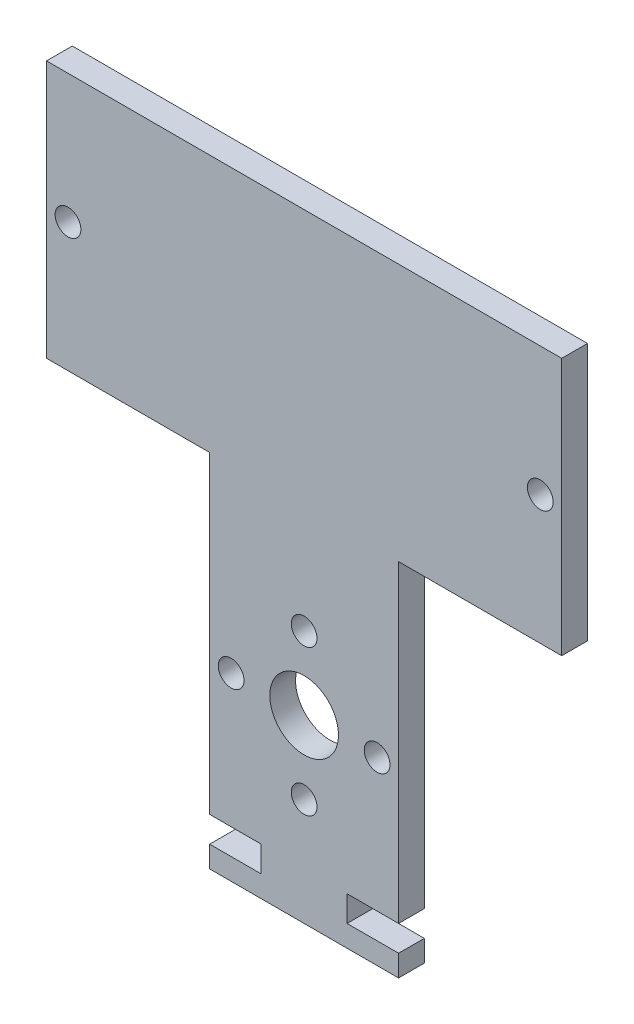
ISO-10303-21;
HEADER;
FILE_DESCRIPTION(('STEP AP214'),'2;1');
FILE_NAME('part.step','',(''),(''),'','','');
FILE_SCHEMA(('AUTOMOTIVE_DESIGN { 1 0 10303 214 1 1 1 1 }'));
ENDSEC;
DATA;
#1=APPLICATION_CONTEXT('core data for automotive mechanical design processes');
#2=APPLICATION_PROTOCOL_DEFINITION('international standard','automotive_design',2000,#1);
#3=PRODUCT_CONTEXT('',#1,'mechanical');
#4=PRODUCT('Part','Part','',(#3));
#5=PRODUCT_RELATED_PRODUCT_CATEGORY('part','',(#4));
#6=PRODUCT_DEFINITION_FORMATION('','',#4);
#7=PRODUCT_DEFINITION_CONTEXT('part definition',#1,'design');
#8=PRODUCT_DEFINITION('design','',#6,#7);
#9=PRODUCT_DEFINITION_SHAPE('','',#8);
#10=(LENGTH_UNIT() NAMED_UNIT(*) SI_UNIT(.MILLI.,.METRE.));
#11=(NAMED_UNIT(*) PLANE_ANGLE_UNIT() SI_UNIT($,.RADIAN.));
#12=(NAMED_UNIT(*) SI_UNIT($,.STERADIAN.) SOLID_ANGLE_UNIT());
#13=UNCERTAINTY_MEASURE_WITH_UNIT(LENGTH_MEASURE(1.E-05),#10,'distance_accuracy_value','');
#14=(GEOMETRIC_REPRESENTATION_CONTEXT(3) GLOBAL_UNCERTAINTY_ASSIGNED_CONTEXT((#13)) GLOBAL_UNIT_ASSIGNED_CONTEXT((#10,
#11,#12)) REPRESENTATION_CONTEXT('',''));
#15=CARTESIAN_POINT('',(0.,0.,0.));
#16=DIRECTION('',(0.,0.,1.));
#17=DIRECTION('',(1.,0.,0.));
#18=AXIS2_PLACEMENT_3D('',#15,#16,#17);
#19=CARTESIAN_POINT('',(0.,0.,3.));
#20=DIRECTION('',(0.,0.,1.));
#21=DIRECTION('',(1.,0.,0.));
#22=AXIS2_PLACEMENT_3D('',#19,#20,#21);
#23=PLANE('',#22);
#24=CARTESIAN_POINT('',(-27.5,36.,3.));
#25=DIRECTION('',(0.,0.,1.));
#26=DIRECTION('',(1.,0.,0.));
#27=AXIS2_PLACEMENT_3D('',#24,#25,#26);
#28=CIRCLE('',#27,1.5);
#29=CARTESIAN_POINT('',(-26.,36.,3.));
#30=VERTEX_POINT('',#29);
#31=EDGE_CURVE('E556',#30,#30,#28,.T.);
#32=ORIENTED_EDGE('',*,*,#31,.F.);
#33=EDGE_LOOP('',(#32));
#34=FACE_BOUND('',#33,.T.);
#35=CARTESIAN_POINT('',(-8.49999999999952,-4.82648585427231E-13,3.));
#36=DIRECTION('',(0.,0.,1.));
#37=DIRECTION('',(1.,0.,0.));
#38=AXIS2_PLACEMENT_3D('',#35,#36,#37);
#39=CIRCLE('',#38,1.50000000000069);
#40=CARTESIAN_POINT('',(-6.99999999999883,-4.82648585427231E-13,3.));
#41=VERTEX_POINT('',#40);
#42=EDGE_CURVE('E568',#41,#41,#39,.T.);
#43=ORIENTED_EDGE('',*,*,#42,.F.);
#44=EDGE_LOOP('',(#43));
#45=FACE_BOUND('',#44,.T.);
#46=CARTESIAN_POINT('',(8.50000000000048,4.81607635647955E-13,3.));
#47=DIRECTION('',(0.,0.,1.));
#48=DIRECTION('',(1.,0.,0.));
#49=AXIS2_PLACEMENT_3D('',#46,#47,#48);
#50=CIRCLE('',#49,1.50000000000035);
#51=CARTESIAN_POINT('',(10.0000000000008,4.81607635647955E-13,3.));
#52=VERTEX_POINT('',#51);
#53=EDGE_CURVE('E580',#52,#52,#50,.T.);
#54=ORIENTED_EDGE('',*,*,#53,.F.);
#55=EDGE_LOOP('',(#54));
#56=FACE_BOUND('',#55,.T.);
#57=DIRECTION('',(0.,-1.,0.));
#58=VECTOR('',#57,1.);
#59=CARTESIAN_POINT('',(-11.,0.,3.));
#60=LINE('',#59,#58);
#61=CARTESIAN_POINT('',(-11.,21.,3.));
#62=VERTEX_POINT('',#61);
#63=CARTESIAN_POINT('',(-11.,-15.5,3.));
#64=VERTEX_POINT('',#63);
#65=EDGE_CURVE('E122',#62,#64,#60,.T.);
#66=ORIENTED_EDGE('',*,*,#65,.T.);
#67=DIRECTION('',(1.,0.,0.));
#68=VECTOR('',#67,1.);
#69=CARTESIAN_POINT('',(-11.,-15.5,3.));
#70=LINE('',#69,#68);
#71=CARTESIAN_POINT('',(-5.,-15.5,3.));
#72=VERTEX_POINT('',#71);
#73=EDGE_CURVE('E304',#64,#72,#70,.T.);
#74=ORIENTED_EDGE('',*,*,#73,.T.);
#75=DIRECTION('',(0.,-1.,0.));
#76=VECTOR('',#75,1.);
#77=CARTESIAN_POINT('',(-5.,-15.5,3.));
#78=LINE('',#77,#76);
#79=CARTESIAN_POINT('',(-5.,-18.5,3.));
#80=VERTEX_POINT('',#79);
#81=EDGE_CURVE('E255',#72,#80,#78,.T.);
#82=ORIENTED_EDGE('',*,*,#81,.T.);
#83=DIRECTION('',(-1.,0.,0.));
#84=VECTOR('',#83,1.);
#85=CARTESIAN_POINT('',(-5.,-18.5,3.));
#86=LINE('',#85,#84);
#87=CARTESIAN_POINT('',(-11.,-18.5,3.));
#88=VERTEX_POINT('',#87);
#89=EDGE_CURVE('E274',#80,#88,#86,.T.);
#90=ORIENTED_EDGE('',*,*,#89,.T.);
#91=DIRECTION('',(0.,-1.,0.));
#92=VECTOR('',#91,1.);
#93=CARTESIAN_POINT('',(-11.,-18.5,3.));
#94=LINE('',#93,#92);
#95=CARTESIAN_POINT('',(-11.,-21.,3.));
#96=VERTEX_POINT('',#95);
#97=EDGE_CURVE('E271',#88,#96,#94,.T.);
#98=ORIENTED_EDGE('',*,*,#97,.T.);
#99=DIRECTION('',(1.,0.,0.));
#100=VECTOR('',#99,1.);
#101=CARTESIAN_POINT('',(-11.,-21.,3.));
#102=LINE('',#101,#100);
#103=CARTESIAN_POINT('',(11.,-21.,3.));
#104=VERTEX_POINT('',#103);
#105=EDGE_CURVE('E273',#96,#104,#102,.T.);
#106=ORIENTED_EDGE('',*,*,#105,.T.);
#107=DIRECTION('',(0.,1.,0.));
#108=VECTOR('',#107,1.);
#109=CARTESIAN_POINT('',(11.,-21.,3.));
#110=LINE('',#109,#108);
#111=CARTESIAN_POINT('',(11.,-18.5,3.));
#112=VERTEX_POINT('',#111);
#113=EDGE_CURVE('E276',#104,#112,#110,.T.);
#114=ORIENTED_EDGE('',*,*,#113,.T.);
#115=DIRECTION('',(-1.,0.,0.));
#116=VECTOR('',#115,1.);
#117=CARTESIAN_POINT('',(11.,-18.5,3.));
#118=LINE('',#117,#116);
#119=CARTESIAN_POINT('',(5.,-18.5,3.));
#120=VERTEX_POINT('',#119);
#121=EDGE_CURVE('E282',#112,#120,#118,.T.);
#122=ORIENTED_EDGE('',*,*,#121,.T.);
#123=DIRECTION('',(0.,1.,0.));
#124=VECTOR('',#123,1.);
#125=CARTESIAN_POINT('',(5.,-18.5,3.));
#126=LINE('',#125,#124);
#127=CARTESIAN_POINT('',(5.,-15.5,3.));
#128=VERTEX_POINT('',#127);
#129=EDGE_CURVE('E284',#120,#128,#126,.T.);
#130=ORIENTED_EDGE('',*,*,#129,.T.);
#131=DIRECTION('',(1.,0.,0.));
#132=VECTOR('',#131,1.);
#133=CARTESIAN_POINT('',(5.,-15.5,3.));
#134=LINE('',#133,#132);
#135=CARTESIAN_POINT('',(11.,-15.5,3.));
#136=VERTEX_POINT('',#135);
#137=EDGE_CURVE('E286',#128,#136,#134,.T.);
#138=ORIENTED_EDGE('',*,*,#137,.T.);
#139=DIRECTION('',(0.,1.,0.));
#140=VECTOR('',#139,1.);
#141=CARTESIAN_POINT('',(11.,-15.5,3.));
#142=LINE('',#141,#140);
#143=CARTESIAN_POINT('',(11.,21.,3.));
#144=VERTEX_POINT('',#143);
#145=EDGE_CURVE('E288',#136,#144,#142,.T.);
#146=ORIENTED_EDGE('',*,*,#145,.T.);
#147=DIRECTION('',(1.,0.,0.));
#148=VECTOR('',#147,1.);
#149=CARTESIAN_POINT('',(30.,21.,3.));
#150=LINE('',#149,#148);
#151=CARTESIAN_POINT('',(30.,21.,3.));
#152=VERTEX_POINT('',#151);
#153=EDGE_CURVE('E290',#144,#152,#150,.T.);
#154=ORIENTED_EDGE('',*,*,#153,.T.);
#155=DIRECTION('',(0.,1.,0.));
#156=VECTOR('',#155,1.);
#157=CARTESIAN_POINT('',(30.,51.,3.));
#158=LINE('',#157,#156);
#159=CARTESIAN_POINT('',(30.,51.,3.));
#160=VERTEX_POINT('',#159);
#161=EDGE_CURVE('E166',#152,#160,#158,.T.);
#162=ORIENTED_EDGE('',*,*,#161,.T.);
#163=DIRECTION('',(-1.,0.,0.));
#164=VECTOR('',#163,1.);
#165=CARTESIAN_POINT('',(-30.,51.,3.));
#166=LINE('',#165,#164);
#167=CARTESIAN_POINT('',(-30.,51.,3.));
#168=VERTEX_POINT('',#167);
#169=EDGE_CURVE('E160',#160,#168,#166,.T.);
#170=ORIENTED_EDGE('',*,*,#169,.T.);
#171=DIRECTION('',(0.,-1.,0.));
#172=VECTOR('',#171,1.);
#173=CARTESIAN_POINT('',(-30.,21.,3.));
#174=LINE('',#173,#172);
#175=CARTESIAN_POINT('',(-30.,21.,3.));
#176=VERTEX_POINT('',#175);
#177=EDGE_CURVE('E164',#168,#176,#174,.T.);
#178=ORIENTED_EDGE('',*,*,#177,.T.);
#179=DIRECTION('',(1.,0.,0.));
#180=VECTOR('',#179,1.);
#181=CARTESIAN_POINT('',(-11.,21.,3.));
#182=LINE('',#181,#180);
#183=EDGE_CURVE('E56',#176,#62,#182,.T.);
#184=ORIENTED_EDGE('',*,*,#183,.T.);
#185=EDGE_LOOP('',(#66,#74,#82,#90,#98,#106,#114,#122,#130,#138,#146,#154,#162,#170,#178,#184));
#186=FACE_BOUND('',#185,.T.);
#187=CARTESIAN_POINT('',(0.,8.5,3.));
#188=DIRECTION('',(0.,0.,1.));
#189=DIRECTION('',(1.,0.,0.));
#190=AXIS2_PLACEMENT_3D('',#187,#188,#189);
#191=CIRCLE('',#190,1.5);
#192=CARTESIAN_POINT('',(1.5,8.5,3.));
#193=VERTEX_POINT('',#192);
#194=EDGE_CURVE('E186',#193,#193,#191,.T.);
#195=ORIENTED_EDGE('',*,*,#194,.F.);
#196=EDGE_LOOP('',(#195));
#197=FACE_BOUND('',#196,.T.);
#198=CARTESIAN_POINT('',(9.63215271295911E-13,-8.5,3.));
#199=DIRECTION('',(0.,0.,1.));
#200=DIRECTION('',(1.,0.,0.));
#201=AXIS2_PLACEMENT_3D('',#198,#199,#200);
#202=CIRCLE('',#201,1.50000000000098);
#203=CARTESIAN_POINT('',(1.50000000000194,-8.5,3.));
#204=VERTEX_POINT('',#203);
#205=EDGE_CURVE('E574',#204,#204,#202,.T.);
#206=ORIENTED_EDGE('',*,*,#205,.F.);
#207=EDGE_LOOP('',(#206));
#208=FACE_BOUND('',#207,.T.);
#209=CARTESIAN_POINT('',(0.,0.,3.));
#210=DIRECTION('',(0.,0.,1.));
#211=DIRECTION('',(1.,0.,0.));
#212=AXIS2_PLACEMENT_3D('',#209,#210,#211);
#213=CIRCLE('',#212,4.);
#214=CARTESIAN_POINT('',(4.,0.,3.));
#215=VERTEX_POINT('',#214);
#216=EDGE_CURVE('E562',#215,#215,#213,.T.);
#217=ORIENTED_EDGE('',*,*,#216,.F.);
#218=EDGE_LOOP('',(#217));
#219=FACE_BOUND('',#218,.T.);
#220=CARTESIAN_POINT('',(27.5,36.,3.));
#221=DIRECTION('',(0.,0.,1.));
#222=DIRECTION('',(1.,0.,0.));
#223=AXIS2_PLACEMENT_3D('',#220,#221,#222);
#224=CIRCLE('',#223,1.5);
#225=CARTESIAN_POINT('',(29.,36.,3.));
#226=VERTEX_POINT('',#225);
#227=EDGE_CURVE('E547',#226,#226,#224,.T.);
#228=ORIENTED_EDGE('',*,*,#227,.F.);
#229=EDGE_LOOP('',(#228));
#230=FACE_BOUND('',#229,.T.);
#231=ADVANCED_FACE('F39',(#34,#45,#56,#186,#197,#208,#219,#230),#23,.T.);
#232=CARTESIAN_POINT('',(0.,0.,0.));
#233=DIRECTION('',(0.,0.,1.));
#234=DIRECTION('',(1.,0.,0.));
#235=AXIS2_PLACEMENT_3D('',#232,#233,#234);
#236=PLANE('',#235);
#237=DIRECTION('',(0.,-1.,0.));
#238=VECTOR('',#237,1.);
#239=CARTESIAN_POINT('',(-11.,0.,0.));
#240=LINE('',#239,#238);
#241=CARTESIAN_POINT('',(-11.,21.,0.));
#242=VERTEX_POINT('',#241);
#243=CARTESIAN_POINT('',(-11.,-15.5,0.));
#244=VERTEX_POINT('',#243);
#245=EDGE_CURVE('E116',#242,#244,#240,.T.);
#246=ORIENTED_EDGE('',*,*,#245,.F.);
#247=DIRECTION('',(1.,0.,0.));
#248=VECTOR('',#247,1.);
#249=CARTESIAN_POINT('',(-11.,21.,0.));
#250=LINE('',#249,#248);
#251=CARTESIAN_POINT('',(-30.,21.,0.));
#252=VERTEX_POINT('',#251);
#253=EDGE_CURVE('E213',#252,#242,#250,.T.);
#254=ORIENTED_EDGE('',*,*,#253,.F.);
#255=DIRECTION('',(0.,-1.,0.));
#256=VECTOR('',#255,1.);
#257=CARTESIAN_POINT('',(-30.,21.,0.));
#258=LINE('',#257,#256);
#259=CARTESIAN_POINT('',(-30.,51.,0.));
#260=VERTEX_POINT('',#259);
#261=EDGE_CURVE('E109',#260,#252,#258,.T.);
#262=ORIENTED_EDGE('',*,*,#261,.F.);
#263=DIRECTION('',(-1.,0.,0.));
#264=VECTOR('',#263,1.);
#265=CARTESIAN_POINT('',(-30.,51.,0.));
#266=LINE('',#265,#264);
#267=CARTESIAN_POINT('',(30.,51.,0.));
#268=VERTEX_POINT('',#267);
#269=EDGE_CURVE('E174',#268,#260,#266,.T.);
#270=ORIENTED_EDGE('',*,*,#269,.F.);
#271=DIRECTION('',(0.,1.,0.));
#272=VECTOR('',#271,1.);
#273=CARTESIAN_POINT('',(30.,51.,0.));
#274=LINE('',#273,#272);
#275=CARTESIAN_POINT('',(30.,21.,0.));
#276=VERTEX_POINT('',#275);
#277=EDGE_CURVE('E209',#276,#268,#274,.T.);
#278=ORIENTED_EDGE('',*,*,#277,.F.);
#279=DIRECTION('',(1.,0.,0.));
#280=VECTOR('',#279,1.);
#281=CARTESIAN_POINT('',(30.,21.,0.));
#282=LINE('',#281,#280);
#283=CARTESIAN_POINT('',(11.,21.,0.));
#284=VERTEX_POINT('',#283);
#285=EDGE_CURVE('E207',#284,#276,#282,.T.);
#286=ORIENTED_EDGE('',*,*,#285,.F.);
#287=DIRECTION('',(0.,1.,0.));
#288=VECTOR('',#287,1.);
#289=CARTESIAN_POINT('',(11.,21.,0.));
#290=LINE('',#289,#288);
#291=CARTESIAN_POINT('',(11.,-15.5,0.));
#292=VERTEX_POINT('',#291);
#293=EDGE_CURVE('E205',#292,#284,#290,.T.);
#294=ORIENTED_EDGE('',*,*,#293,.F.);
#295=DIRECTION('',(1.,0.,0.));
#296=VECTOR('',#295,1.);
#297=CARTESIAN_POINT('',(5.,-15.5,0.));
#298=LINE('',#297,#296);
#299=CARTESIAN_POINT('',(5.,-15.5,0.));
#300=VERTEX_POINT('',#299);
#301=EDGE_CURVE('E202',#300,#292,#298,.T.);
#302=ORIENTED_EDGE('',*,*,#301,.F.);
#303=DIRECTION('',(0.,1.,0.));
#304=VECTOR('',#303,1.);
#305=CARTESIAN_POINT('',(5.,-18.5,0.));
#306=LINE('',#305,#304);
#307=CARTESIAN_POINT('',(5.,-18.5,0.));
#308=VERTEX_POINT('',#307);
#309=EDGE_CURVE('E200',#308,#300,#306,.T.);
#310=ORIENTED_EDGE('',*,*,#309,.F.);
#311=DIRECTION('',(-1.,0.,0.));
#312=VECTOR('',#311,1.);
#313=CARTESIAN_POINT('',(11.,-18.5,0.));
#314=LINE('',#313,#312);
#315=CARTESIAN_POINT('',(11.,-18.5,0.));
#316=VERTEX_POINT('',#315);
#317=EDGE_CURVE('E198',#316,#308,#314,.T.);
#318=ORIENTED_EDGE('',*,*,#317,.F.);
#319=DIRECTION('',(0.,1.,0.));
#320=VECTOR('',#319,1.);
#321=CARTESIAN_POINT('',(11.,-21.,0.));
#322=LINE('',#321,#320);
#323=CARTESIAN_POINT('',(11.,-21.,0.));
#324=VERTEX_POINT('',#323);
#325=EDGE_CURVE('E196',#324,#316,#322,.T.);
#326=ORIENTED_EDGE('',*,*,#325,.F.);
#327=DIRECTION('',(1.,0.,0.));
#328=VECTOR('',#327,1.);
#329=CARTESIAN_POINT('',(-11.,-21.,0.));
#330=LINE('',#329,#328);
#331=CARTESIAN_POINT('',(-11.,-21.,0.));
#332=VERTEX_POINT('',#331);
#333=EDGE_CURVE('E194',#332,#324,#330,.T.);
#334=ORIENTED_EDGE('',*,*,#333,.F.);
#335=DIRECTION('',(0.,-1.,0.));
#336=VECTOR('',#335,1.);
#337=CARTESIAN_POINT('',(-11.,-18.5,0.));
#338=LINE('',#337,#336);
#339=CARTESIAN_POINT('',(-11.,-18.5,0.));
#340=VERTEX_POINT('',#339);
#341=EDGE_CURVE('E192',#340,#332,#338,.T.);
#342=ORIENTED_EDGE('',*,*,#341,.F.);
#343=DIRECTION('',(-1.,0.,0.));
#344=VECTOR('',#343,1.);
#345=CARTESIAN_POINT('',(-5.,-18.5,0.));
#346=LINE('',#345,#344);
#347=CARTESIAN_POINT('',(-5.,-18.5,0.));
#348=VERTEX_POINT('',#347);
#349=EDGE_CURVE('E190',#348,#340,#346,.T.);
#350=ORIENTED_EDGE('',*,*,#349,.F.);
#351=DIRECTION('',(0.,-1.,0.));
#352=VECTOR('',#351,1.);
#353=CARTESIAN_POINT('',(-5.,-15.5,0.));
#354=LINE('',#353,#352);
#355=CARTESIAN_POINT('',(-5.,-15.5,0.));
#356=VERTEX_POINT('',#355);
#357=EDGE_CURVE('E188',#356,#348,#354,.T.);
#358=ORIENTED_EDGE('',*,*,#357,.F.);
#359=DIRECTION('',(1.,0.,0.));
#360=VECTOR('',#359,1.);
#361=CARTESIAN_POINT('',(-11.,-15.5,0.));
#362=LINE('',#361,#360);
#363=EDGE_CURVE('E185',#244,#356,#362,.T.);
#364=ORIENTED_EDGE('',*,*,#363,.F.);
#365=EDGE_LOOP('',(#246,#254,#262,#270,#278,#286,#294,#302,#310,#318,#326,#334,#342,#350,#358,#364));
#366=FACE_BOUND('',#365,.T.);
#367=CARTESIAN_POINT('',(0.,8.5,0.));
#368=DIRECTION('',(0.,0.,1.));
#369=DIRECTION('',(1.,0.,0.));
#370=AXIS2_PLACEMENT_3D('',#367,#368,#369);
#371=CIRCLE('',#370,1.5);
#372=CARTESIAN_POINT('',(1.5,8.5,0.));
#373=VERTEX_POINT('',#372);
#374=EDGE_CURVE('E308',#373,#373,#371,.T.);
#375=ORIENTED_EDGE('',*,*,#374,.T.);
#376=EDGE_LOOP('',(#375));
#377=FACE_BOUND('',#376,.T.);
#378=CARTESIAN_POINT('',(8.50000000000048,4.81607635647955E-13,0.));
#379=DIRECTION('',(0.,0.,1.));
#380=DIRECTION('',(1.,0.,0.));
#381=AXIS2_PLACEMENT_3D('',#378,#379,#380);
#382=CIRCLE('',#381,1.50000000000035);
#383=CARTESIAN_POINT('',(10.0000000000008,4.81607635647955E-13,0.));
#384=VERTEX_POINT('',#383);
#385=EDGE_CURVE('E577',#384,#384,#382,.T.);
#386=ORIENTED_EDGE('',*,*,#385,.T.);
#387=EDGE_LOOP('',(#386));
#388=FACE_BOUND('',#387,.T.);
#389=CARTESIAN_POINT('',(9.63215271295911E-13,-8.5,0.));
#390=DIRECTION('',(0.,0.,1.));
#391=DIRECTION('',(1.,0.,0.));
#392=AXIS2_PLACEMENT_3D('',#389,#390,#391);
#393=CIRCLE('',#392,1.50000000000098);
#394=CARTESIAN_POINT('',(1.50000000000194,-8.5,0.));
#395=VERTEX_POINT('',#394);
#396=EDGE_CURVE('E571',#395,#395,#393,.T.);
#397=ORIENTED_EDGE('',*,*,#396,.T.);
#398=EDGE_LOOP('',(#397));
#399=FACE_BOUND('',#398,.T.);
#400=CARTESIAN_POINT('',(-8.49999999999952,-4.82648585427231E-13,0.));
#401=DIRECTION('',(0.,0.,1.));
#402=DIRECTION('',(1.,0.,0.));
#403=AXIS2_PLACEMENT_3D('',#400,#401,#402);
#404=CIRCLE('',#403,1.50000000000069);
#405=CARTESIAN_POINT('',(-6.99999999999883,-4.82648585427231E-13,0.));
#406=VERTEX_POINT('',#405);
#407=EDGE_CURVE('E565',#406,#406,#404,.T.);
#408=ORIENTED_EDGE('',*,*,#407,.T.);
#409=EDGE_LOOP('',(#408));
#410=FACE_BOUND('',#409,.T.);
#411=CARTESIAN_POINT('',(0.,0.,0.));
#412=DIRECTION('',(0.,0.,1.));
#413=DIRECTION('',(1.,0.,0.));
#414=AXIS2_PLACEMENT_3D('',#411,#412,#413);
#415=CIRCLE('',#414,4.);
#416=CARTESIAN_POINT('',(4.,0.,0.));
#417=VERTEX_POINT('',#416);
#418=EDGE_CURVE('E559',#417,#417,#415,.T.);
#419=ORIENTED_EDGE('',*,*,#418,.T.);
#420=EDGE_LOOP('',(#419));
#421=FACE_BOUND('',#420,.T.);
#422=CARTESIAN_POINT('',(-27.5,36.,0.));
#423=DIRECTION('',(0.,0.,1.));
#424=DIRECTION('',(1.,0.,0.));
#425=AXIS2_PLACEMENT_3D('',#422,#423,#424);
#426=CIRCLE('',#425,1.5);
#427=CARTESIAN_POINT('',(-26.,36.,0.));
#428=VERTEX_POINT('',#427);
#429=EDGE_CURVE('E553',#428,#428,#426,.T.);
#430=ORIENTED_EDGE('',*,*,#429,.T.);
#431=EDGE_LOOP('',(#430));
#432=FACE_BOUND('',#431,.T.);
#433=CARTESIAN_POINT('',(27.5,36.,0.));
#434=DIRECTION('',(0.,0.,1.));
#435=DIRECTION('',(1.,0.,0.));
#436=AXIS2_PLACEMENT_3D('',#433,#434,#435);
#437=CIRCLE('',#436,1.5);
#438=CARTESIAN_POINT('',(29.,36.,0.));
#439=VERTEX_POINT('',#438);
#440=EDGE_CURVE('E550',#439,#439,#437,.T.);
#441=ORIENTED_EDGE('',*,*,#440,.T.);
#442=EDGE_LOOP('',(#441));
#443=FACE_BOUND('',#442,.T.);
#444=ADVANCED_FACE('F259',(#366,#377,#388,#399,#410,#421,#432,#443),#236,.F.);
#445=CARTESIAN_POINT('',(-11.,0.,3.));
#446=DIRECTION('',(1.,0.,0.));
#447=DIRECTION('',(0.,1.,0.));
#448=AXIS2_PLACEMENT_3D('',#445,#446,#447);
#449=PLANE('',#448);
#450=ORIENTED_EDGE('',*,*,#245,.T.);
#451=DIRECTION('',(0.,0.,-1.));
#452=VECTOR('',#451,1.);
#453=CARTESIAN_POINT('',(-11.,-15.5,3.));
#454=LINE('',#453,#452);
#455=EDGE_CURVE('E11',#64,#244,#454,.T.);
#456=ORIENTED_EDGE('',*,*,#455,.F.);
#457=ORIENTED_EDGE('',*,*,#65,.F.);
#458=DIRECTION('',(0.,0.,-1.));
#459=VECTOR('',#458,1.);
#460=CARTESIAN_POINT('',(-11.,21.,3.));
#461=LINE('',#460,#459);
#462=EDGE_CURVE('E180',#62,#242,#461,.T.);
#463=ORIENTED_EDGE('',*,*,#462,.T.);
#464=EDGE_LOOP('',(#450,#456,#457,#463));
#465=FACE_BOUND('',#464,.T.);
#466=ADVANCED_FACE('F41',(#465),#449,.F.);
#467=CARTESIAN_POINT('',(-11.,-15.5,3.));
#468=DIRECTION('',(0.,1.,0.));
#469=DIRECTION('',(0.,0.,1.));
#470=AXIS2_PLACEMENT_3D('',#467,#468,#469);
#471=PLANE('',#470);
#472=ORIENTED_EDGE('',*,*,#363,.T.);
#473=DIRECTION('',(0.,0.,-1.));
#474=VECTOR('',#473,1.);
#475=CARTESIAN_POINT('',(-5.,-15.5,3.));
#476=LINE('',#475,#474);
#477=EDGE_CURVE('E48',#72,#356,#476,.T.);
#478=ORIENTED_EDGE('',*,*,#477,.F.);
#479=ORIENTED_EDGE('',*,*,#73,.F.);
#480=ORIENTED_EDGE('',*,*,#455,.T.);
#481=EDGE_LOOP('',(#472,#478,#479,#480));
#482=FACE_BOUND('',#481,.T.);
#483=ADVANCED_FACE('F310',(#482),#471,.F.);
#484=CARTESIAN_POINT('',(-5.,-15.5,3.));
#485=DIRECTION('',(1.,0.,0.));
#486=DIRECTION('',(0.,1.,0.));
#487=AXIS2_PLACEMENT_3D('',#484,#485,#486);
#488=PLANE('',#487);
#489=ORIENTED_EDGE('',*,*,#357,.T.);
#490=DIRECTION('',(0.,0.,-1.));
#491=VECTOR('',#490,1.);
#492=CARTESIAN_POINT('',(-5.,-18.5,3.));
#493=LINE('',#492,#491);
#494=EDGE_CURVE('E246',#80,#348,#493,.T.);
#495=ORIENTED_EDGE('',*,*,#494,.F.);
#496=ORIENTED_EDGE('',*,*,#81,.F.);
#497=ORIENTED_EDGE('',*,*,#477,.T.);
#498=EDGE_LOOP('',(#489,#495,#496,#497));
#499=FACE_BOUND('',#498,.T.);
#500=ADVANCED_FACE('F253',(#499),#488,.F.);
#501=CARTESIAN_POINT('',(-5.,-18.5,3.));
#502=DIRECTION('',(0.,-1.,0.));
#503=DIRECTION('',(0.,0.,-1.));
#504=AXIS2_PLACEMENT_3D('',#501,#502,#503);
#505=PLANE('',#504);
#506=ORIENTED_EDGE('',*,*,#349,.T.);
#507=DIRECTION('',(0.,0.,-1.));
#508=VECTOR('',#507,1.);
#509=CARTESIAN_POINT('',(-11.,-18.5,3.));
#510=LINE('',#509,#508);
#511=EDGE_CURVE('E243',#88,#340,#510,.T.);
#512=ORIENTED_EDGE('',*,*,#511,.F.);
#513=ORIENTED_EDGE('',*,*,#89,.F.);
#514=ORIENTED_EDGE('',*,*,#494,.T.);
#515=EDGE_LOOP('',(#506,#512,#513,#514));
#516=FACE_BOUND('',#515,.T.);
#517=ADVANCED_FACE('F265',(#516),#505,.F.);
#518=CARTESIAN_POINT('',(-11.,-18.5,3.));
#519=DIRECTION('',(1.,0.,0.));
#520=DIRECTION('',(0.,1.,0.));
#521=AXIS2_PLACEMENT_3D('',#518,#519,#520);
#522=PLANE('',#521);
#523=ORIENTED_EDGE('',*,*,#341,.T.);
#524=DIRECTION('',(0.,0.,-1.));
#525=VECTOR('',#524,1.);
#526=CARTESIAN_POINT('',(-11.,-21.,3.));
#527=LINE('',#526,#525);
#528=EDGE_CURVE('E240',#96,#332,#527,.T.);
#529=ORIENTED_EDGE('',*,*,#528,.F.);
#530=ORIENTED_EDGE('',*,*,#97,.F.);
#531=ORIENTED_EDGE('',*,*,#511,.T.);
#532=EDGE_LOOP('',(#523,#529,#530,#531));
#533=FACE_BOUND('',#532,.T.);
#534=ADVANCED_FACE('F269',(#533),#522,.F.);
#535=CARTESIAN_POINT('',(-11.,-21.,3.));
#536=DIRECTION('',(0.,1.,0.));
#537=DIRECTION('',(0.,0.,1.));
#538=AXIS2_PLACEMENT_3D('',#535,#536,#537);
#539=PLANE('',#538);
#540=ORIENTED_EDGE('',*,*,#333,.T.);
#541=DIRECTION('',(0.,0.,-1.));
#542=VECTOR('',#541,1.);
#543=CARTESIAN_POINT('',(11.,-21.,3.));
#544=LINE('',#543,#542);
#545=EDGE_CURVE('E237',#104,#324,#544,.T.);
#546=ORIENTED_EDGE('',*,*,#545,.F.);
#547=ORIENTED_EDGE('',*,*,#105,.F.);
#548=ORIENTED_EDGE('',*,*,#528,.T.);
#549=EDGE_LOOP('',(#540,#546,#547,#548));
#550=FACE_BOUND('',#549,.T.);
#551=ADVANCED_FACE('F359',(#550),#539,.F.);
#552=CARTESIAN_POINT('',(11.,-21.,3.));
#553=DIRECTION('',(-1.,0.,0.));
#554=DIRECTION('',(0.,-1.,0.));
#555=AXIS2_PLACEMENT_3D('',#552,#553,#554);
#556=PLANE('',#555);
#557=ORIENTED_EDGE('',*,*,#325,.T.);
#558=DIRECTION('',(0.,0.,-1.));
#559=VECTOR('',#558,1.);
#560=CARTESIAN_POINT('',(11.,-18.5,3.));
#561=LINE('',#560,#559);
#562=EDGE_CURVE('E234',#112,#316,#561,.T.);
#563=ORIENTED_EDGE('',*,*,#562,.F.);
#564=ORIENTED_EDGE('',*,*,#113,.F.);
#565=ORIENTED_EDGE('',*,*,#545,.T.);
#566=EDGE_LOOP('',(#557,#563,#564,#565));
#567=FACE_BOUND('',#566,.T.);
#568=ADVANCED_FACE('F355',(#567),#556,.F.);
#569=CARTESIAN_POINT('',(11.,-18.5,3.));
#570=DIRECTION('',(0.,-1.,0.));
#571=DIRECTION('',(1.,0.,0.));
#572=AXIS2_PLACEMENT_3D('',#569,#570,#571);
#573=PLANE('',#572);
#574=ORIENTED_EDGE('',*,*,#317,.T.);
#575=DIRECTION('',(0.,0.,-1.));
#576=VECTOR('',#575,1.);
#577=CARTESIAN_POINT('',(5.,-18.5,3.));
#578=LINE('',#577,#576);
#579=EDGE_CURVE('E231',#120,#308,#578,.T.);
#580=ORIENTED_EDGE('',*,*,#579,.F.);
#581=ORIENTED_EDGE('',*,*,#121,.F.);
#582=ORIENTED_EDGE('',*,*,#562,.T.);
#583=EDGE_LOOP('',(#574,#580,#581,#582));
#584=FACE_BOUND('',#583,.T.);
#585=ADVANCED_FACE('F351',(#584),#573,.F.);
#586=CARTESIAN_POINT('',(5.,-18.5,3.));
#587=DIRECTION('',(-1.,0.,0.));
#588=DIRECTION('',(0.,0.,1.));
#589=AXIS2_PLACEMENT_3D('',#586,#587,#588);
#590=PLANE('',#589);
#591=ORIENTED_EDGE('',*,*,#309,.T.);
#592=DIRECTION('',(0.,0.,-1.));
#593=VECTOR('',#592,1.);
#594=CARTESIAN_POINT('',(5.,-15.5,3.));
#595=LINE('',#594,#593);
#596=EDGE_CURVE('E228',#128,#300,#595,.T.);
#597=ORIENTED_EDGE('',*,*,#596,.F.);
#598=ORIENTED_EDGE('',*,*,#129,.F.);
#599=ORIENTED_EDGE('',*,*,#579,.T.);
#600=EDGE_LOOP('',(#591,#597,#598,#599));
#601=FACE_BOUND('',#600,.T.);
#602=ADVANCED_FACE('F347',(#601),#590,.F.);
#603=CARTESIAN_POINT('',(5.,-15.5,3.));
#604=DIRECTION('',(0.,1.,0.));
#605=DIRECTION('',(0.,0.,1.));
#606=AXIS2_PLACEMENT_3D('',#603,#604,#605);
#607=PLANE('',#606);
#608=ORIENTED_EDGE('',*,*,#301,.T.);
#609=DIRECTION('',(0.,0.,-1.));
#610=VECTOR('',#609,1.);
#611=CARTESIAN_POINT('',(11.,-15.5,3.));
#612=LINE('',#611,#610);
#613=EDGE_CURVE('E225',#136,#292,#612,.T.);
#614=ORIENTED_EDGE('',*,*,#613,.F.);
#615=ORIENTED_EDGE('',*,*,#137,.F.);
#616=ORIENTED_EDGE('',*,*,#596,.T.);
#617=EDGE_LOOP('',(#608,#614,#615,#616));
#618=FACE_BOUND('',#617,.T.);
#619=ADVANCED_FACE('F343',(#618),#607,.F.);
#620=CARTESIAN_POINT('',(11.,21.,3.));
#621=DIRECTION('',(-1.,0.,0.));
#622=DIRECTION('',(0.,0.,1.));
#623=AXIS2_PLACEMENT_3D('',#620,#621,#622);
#624=PLANE('',#623);
#625=ORIENTED_EDGE('',*,*,#293,.T.);
#626=DIRECTION('',(0.,0.,-1.));
#627=VECTOR('',#626,1.);
#628=CARTESIAN_POINT('',(11.,21.,3.));
#629=LINE('',#628,#627);
#630=EDGE_CURVE('E222',#144,#284,#629,.T.);
#631=ORIENTED_EDGE('',*,*,#630,.F.);
#632=ORIENTED_EDGE('',*,*,#145,.F.);
#633=ORIENTED_EDGE('',*,*,#613,.T.);
#634=EDGE_LOOP('',(#625,#631,#632,#633));
#635=FACE_BOUND('',#634,.T.);
#636=ADVANCED_FACE('F340',(#635),#624,.F.);
#637=CARTESIAN_POINT('',(30.,21.,3.));
#638=DIRECTION('',(0.,1.,0.));
#639=DIRECTION('',(-1.,0.,0.));
#640=AXIS2_PLACEMENT_3D('',#637,#638,#639);
#641=PLANE('',#640);
#642=ORIENTED_EDGE('',*,*,#285,.T.);
#643=DIRECTION('',(0.,0.,-1.));
#644=VECTOR('',#643,1.);
#645=CARTESIAN_POINT('',(30.,21.,3.));
#646=LINE('',#645,#644);
#647=EDGE_CURVE('E219',#152,#276,#646,.T.);
#648=ORIENTED_EDGE('',*,*,#647,.F.);
#649=ORIENTED_EDGE('',*,*,#153,.F.);
#650=ORIENTED_EDGE('',*,*,#630,.T.);
#651=EDGE_LOOP('',(#642,#648,#649,#650));
#652=FACE_BOUND('',#651,.T.);
#653=ADVANCED_FACE('F296',(#652),#641,.F.);
#654=CARTESIAN_POINT('',(30.,51.,3.));
#655=DIRECTION('',(-1.,0.,0.));
#656=DIRECTION('',(0.,-1.,0.));
#657=AXIS2_PLACEMENT_3D('',#654,#655,#656);
#658=PLANE('',#657);
#659=ORIENTED_EDGE('',*,*,#277,.T.);
#660=DIRECTION('',(0.,0.,-1.));
#661=VECTOR('',#660,1.);
#662=CARTESIAN_POINT('',(30.,51.,3.));
#663=LINE('',#662,#661);
#664=EDGE_CURVE('E175',#160,#268,#663,.T.);
#665=ORIENTED_EDGE('',*,*,#664,.F.);
#666=ORIENTED_EDGE('',*,*,#161,.F.);
#667=ORIENTED_EDGE('',*,*,#647,.T.);
#668=EDGE_LOOP('',(#659,#665,#666,#667));
#669=FACE_BOUND('',#668,.T.);
#670=ADVANCED_FACE('F300',(#669),#658,.F.);
#671=CARTESIAN_POINT('',(-30.,51.,3.));
#672=DIRECTION('',(0.,-1.,0.));
#673=DIRECTION('',(0.,0.,-1.));
#674=AXIS2_PLACEMENT_3D('',#671,#672,#673);
#675=PLANE('',#674);
#676=ORIENTED_EDGE('',*,*,#269,.T.);
#677=DIRECTION('',(0.,0.,-1.));
#678=VECTOR('',#677,1.);
#679=CARTESIAN_POINT('',(-30.,51.,3.));
#680=LINE('',#679,#678);
#681=EDGE_CURVE('E171',#168,#260,#680,.T.);
#682=ORIENTED_EDGE('',*,*,#681,.F.);
#683=ORIENTED_EDGE('',*,*,#169,.F.);
#684=ORIENTED_EDGE('',*,*,#664,.T.);
#685=EDGE_LOOP('',(#676,#682,#683,#684));
#686=FACE_BOUND('',#685,.T.);
#687=ADVANCED_FACE('F172',(#686),#675,.F.);
#688=CARTESIAN_POINT('',(-30.,21.,3.));
#689=DIRECTION('',(1.,0.,0.));
#690=DIRECTION('',(0.,0.,-1.));
#691=AXIS2_PLACEMENT_3D('',#688,#689,#690);
#692=PLANE('',#691);
#693=ORIENTED_EDGE('',*,*,#261,.T.);
#694=DIRECTION('',(0.,0.,-1.));
#695=VECTOR('',#694,1.);
#696=CARTESIAN_POINT('',(-30.,21.,3.));
#697=LINE('',#696,#695);
#698=EDGE_CURVE('E176',#176,#252,#697,.T.);
#699=ORIENTED_EDGE('',*,*,#698,.F.);
#700=ORIENTED_EDGE('',*,*,#177,.F.);
#701=ORIENTED_EDGE('',*,*,#681,.T.);
#702=EDGE_LOOP('',(#693,#699,#700,#701));
#703=FACE_BOUND('',#702,.T.);
#704=ADVANCED_FACE('F178',(#703),#692,.F.);
#705=CARTESIAN_POINT('',(-11.,21.,3.));
#706=DIRECTION('',(0.,1.,0.));
#707=DIRECTION('',(-1.,0.,0.));
#708=AXIS2_PLACEMENT_3D('',#705,#706,#707);
#709=PLANE('',#708);
#710=ORIENTED_EDGE('',*,*,#253,.T.);
#711=ORIENTED_EDGE('',*,*,#462,.F.);
#712=ORIENTED_EDGE('',*,*,#183,.F.);
#713=ORIENTED_EDGE('',*,*,#698,.T.);
#714=EDGE_LOOP('',(#710,#711,#712,#713));
#715=FACE_BOUND('',#714,.T.);
#716=ADVANCED_FACE('F302',(#715),#709,.F.);
#717=CARTESIAN_POINT('',(0.,8.5,3.));
#718=DIRECTION('',(0.,0.,-1.));
#719=DIRECTION('',(-1.,0.,0.));
#720=AXIS2_PLACEMENT_3D('',#717,#718,#719);
#721=CYLINDRICAL_SURFACE('',#720,1.5);
#722=ORIENTED_EDGE('',*,*,#194,.T.);
#723=EDGE_LOOP('',(#722));
#724=FACE_BOUND('',#723,.T.);
#725=ORIENTED_EDGE('',*,*,#374,.F.);
#726=EDGE_LOOP('',(#725));
#727=FACE_BOUND('',#726,.T.);
#728=ADVANCED_FACE('F327',(#724,#727),#721,.F.);
#729=CARTESIAN_POINT('',(8.50000000000048,4.81607635647955E-13,3.));
#730=DIRECTION('',(0.,0.,-1.));
#731=DIRECTION('',(-1.,0.,0.));
#732=AXIS2_PLACEMENT_3D('',#729,#730,#731);
#733=CYLINDRICAL_SURFACE('',#732,1.50000000000035);
#734=ORIENTED_EDGE('',*,*,#53,.T.);
#735=EDGE_LOOP('',(#734));
#736=FACE_BOUND('',#735,.T.);
#737=ORIENTED_EDGE('',*,*,#385,.F.);
#738=EDGE_LOOP('',(#737));
#739=FACE_BOUND('',#738,.T.);
#740=ADVANCED_FACE('F425',(#736,#739),#733,.F.);
#741=CARTESIAN_POINT('',(9.63215271295911E-13,-8.5,3.));
#742=DIRECTION('',(0.,0.,-1.));
#743=DIRECTION('',(-1.,0.,0.));
#744=AXIS2_PLACEMENT_3D('',#741,#742,#743);
#745=CYLINDRICAL_SURFACE('',#744,1.50000000000098);
#746=ORIENTED_EDGE('',*,*,#205,.T.);
#747=EDGE_LOOP('',(#746));
#748=FACE_BOUND('',#747,.T.);
#749=ORIENTED_EDGE('',*,*,#396,.F.);
#750=EDGE_LOOP('',(#749));
#751=FACE_BOUND('',#750,.T.);
#752=ADVANCED_FACE('F432',(#748,#751),#745,.F.);
#753=CARTESIAN_POINT('',(-8.49999999999952,-4.82648585427231E-13,3.));
#754=DIRECTION('',(0.,0.,-1.));
#755=DIRECTION('',(-1.,0.,0.));
#756=AXIS2_PLACEMENT_3D('',#753,#754,#755);
#757=CYLINDRICAL_SURFACE('',#756,1.50000000000069);
#758=ORIENTED_EDGE('',*,*,#42,.T.);
#759=EDGE_LOOP('',(#758));
#760=FACE_BOUND('',#759,.T.);
#761=ORIENTED_EDGE('',*,*,#407,.F.);
#762=EDGE_LOOP('',(#761));
#763=FACE_BOUND('',#762,.T.);
#764=ADVANCED_FACE('F439',(#760,#763),#757,.F.);
#765=CARTESIAN_POINT('',(0.,0.,3.));
#766=DIRECTION('',(0.,0.,-1.));
#767=DIRECTION('',(-1.,0.,0.));
#768=AXIS2_PLACEMENT_3D('',#765,#766,#767);
#769=CYLINDRICAL_SURFACE('',#768,4.);
#770=ORIENTED_EDGE('',*,*,#216,.T.);
#771=EDGE_LOOP('',(#770));
#772=FACE_BOUND('',#771,.T.);
#773=ORIENTED_EDGE('',*,*,#418,.F.);
#774=EDGE_LOOP('',(#773));
#775=FACE_BOUND('',#774,.T.);
#776=ADVANCED_FACE('F447',(#772,#775),#769,.F.);
#777=CARTESIAN_POINT('',(-27.5,36.,3.));
#778=DIRECTION('',(0.,0.,-1.));
#779=DIRECTION('',(-1.,0.,0.));
#780=AXIS2_PLACEMENT_3D('',#777,#778,#779);
#781=CYLINDRICAL_SURFACE('',#780,1.5);
#782=ORIENTED_EDGE('',*,*,#31,.T.);
#783=EDGE_LOOP('',(#782));
#784=FACE_BOUND('',#783,.T.);
#785=ORIENTED_EDGE('',*,*,#429,.F.);
#786=EDGE_LOOP('',(#785));
#787=FACE_BOUND('',#786,.T.);
#788=ADVANCED_FACE('F455',(#784,#787),#781,.F.);
#789=CARTESIAN_POINT('',(27.5,36.,3.));
#790=DIRECTION('',(0.,0.,-1.));
#791=DIRECTION('',(-1.,0.,0.));
#792=AXIS2_PLACEMENT_3D('',#789,#790,#791);
#793=CYLINDRICAL_SURFACE('',#792,1.5);
#794=ORIENTED_EDGE('',*,*,#227,.T.);
#795=EDGE_LOOP('',(#794));
#796=FACE_BOUND('',#795,.T.);
#797=ORIENTED_EDGE('',*,*,#440,.F.);
#798=EDGE_LOOP('',(#797));
#799=FACE_BOUND('',#798,.T.);
#800=ADVANCED_FACE('F463',(#796,#799),#793,.F.);
#801=CLOSED_SHELL('',(#231,#444,#466,#483,#500,#517,#534,#551,#568,#585,#602,#619,#636,#653,
#670,#687,#704,#716,#728,#740,#752,#764,#776,#788,#800));
#802=MANIFOLD_SOLID_BREP('B2',#801);
#803=ADVANCED_BREP_SHAPE_REPRESENTATION('',(#18,#802),#14);
#804=SHAPE_DEFINITION_REPRESENTATION(#9,#803);
ENDSEC;
END-ISO-10303-21;
